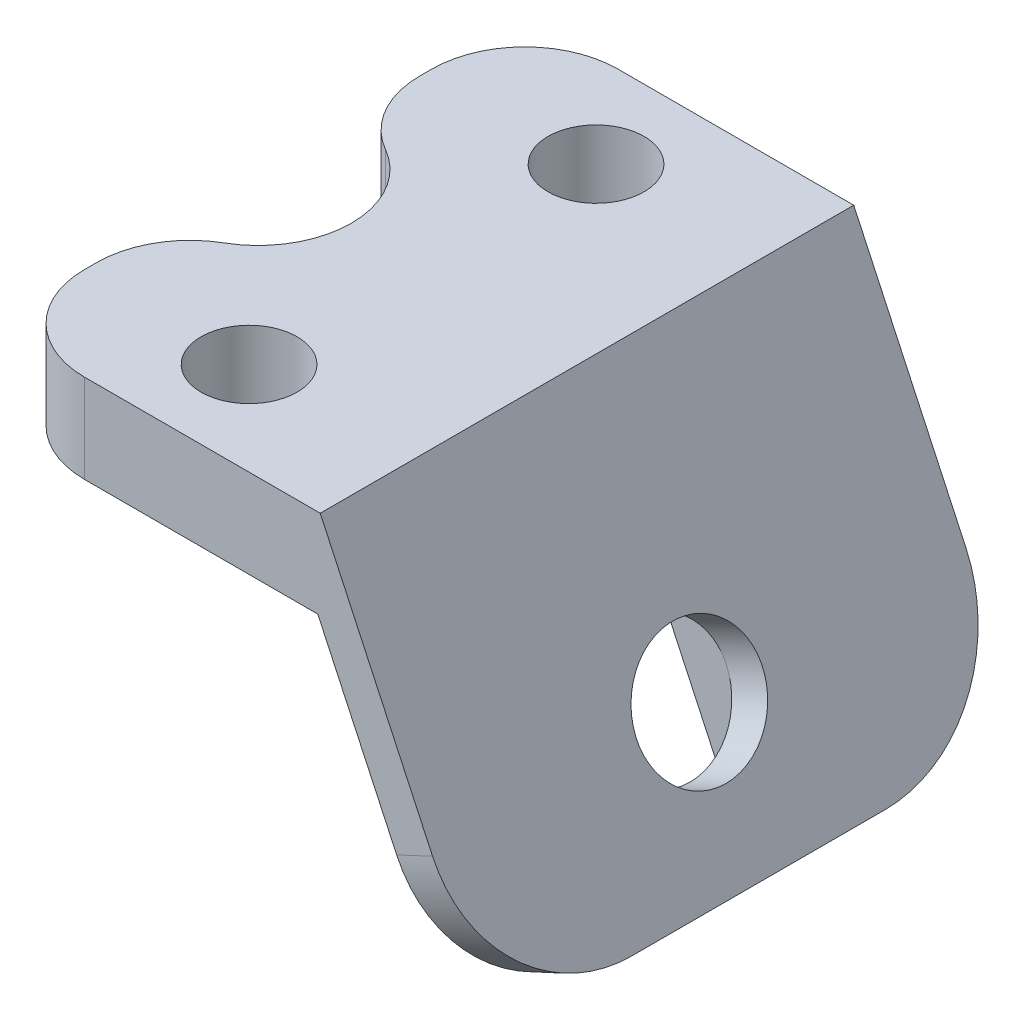
ISO-10303-21;
HEADER;
FILE_DESCRIPTION(('STEP AP214'),'2;1');
FILE_NAME('part.step','',(''),(''),'','','');
FILE_SCHEMA(('AUTOMOTIVE_DESIGN { 1 0 10303 214 1 1 1 1 }'));
ENDSEC;
DATA;
#1=APPLICATION_CONTEXT('core data for automotive mechanical design processes');
#2=APPLICATION_PROTOCOL_DEFINITION('international standard','automotive_design',2000,#1);
#3=PRODUCT_CONTEXT('',#1,'mechanical');
#4=PRODUCT('Part','Part','',(#3));
#5=PRODUCT_RELATED_PRODUCT_CATEGORY('part','',(#4));
#6=PRODUCT_DEFINITION_FORMATION('','',#4);
#7=PRODUCT_DEFINITION_CONTEXT('part definition',#1,'design');
#8=PRODUCT_DEFINITION('design','',#6,#7);
#9=PRODUCT_DEFINITION_SHAPE('','',#8);
#10=(LENGTH_UNIT() NAMED_UNIT(*) SI_UNIT(.MILLI.,.METRE.));
#11=(NAMED_UNIT(*) PLANE_ANGLE_UNIT() SI_UNIT($,.RADIAN.));
#12=(NAMED_UNIT(*) SI_UNIT($,.STERADIAN.) SOLID_ANGLE_UNIT());
#13=UNCERTAINTY_MEASURE_WITH_UNIT(LENGTH_MEASURE(1.E-05),#10,'distance_accuracy_value','');
#14=(GEOMETRIC_REPRESENTATION_CONTEXT(3) GLOBAL_UNCERTAINTY_ASSIGNED_CONTEXT((#13)) GLOBAL_UNIT_ASSIGNED_CONTEXT((#10,
#11,#12)) REPRESENTATION_CONTEXT('',''));
#15=CARTESIAN_POINT('',(0.,0.,0.));
#16=DIRECTION('',(0.,0.,1.));
#17=DIRECTION('',(1.,0.,0.));
#18=AXIS2_PLACEMENT_3D('',#15,#16,#17);
#19=CARTESIAN_POINT('',(0.,0.,29.0576));
#20=DIRECTION('',(1.,0.,0.));
#21=DIRECTION('',(0.,0.,-1.));
#22=AXIS2_PLACEMENT_3D('',#19,#20,#21);
#23=PLANE('',#22);
#24=DIRECTION('',(0.,0.,-1.));
#25=VECTOR('',#24,1.);
#26=CARTESIAN_POINT('',(0.,0.,29.0576));
#27=LINE('',#26,#25);
#28=CARTESIAN_POINT('',(0.,0.,5.7299818975501));
#29=VERTEX_POINT('',#28);
#30=CARTESIAN_POINT('',(0.,0.,5.08));
#31=VERTEX_POINT('',#30);
#32=EDGE_CURVE('E274',#29,#31,#27,.T.);
#33=ORIENTED_EDGE('',*,*,#32,.F.);
#34=DIRECTION('',(0.,1.,0.));
#35=VECTOR('',#34,1.);
#36=CARTESIAN_POINT('',(0.,0.,5.7299818975501));
#37=LINE('',#36,#35);
#38=CARTESIAN_POINT('',(0.,4.826,5.7299818975501));
#39=VERTEX_POINT('',#38);
#40=EDGE_CURVE('E11',#29,#39,#37,.T.);
#41=ORIENTED_EDGE('',*,*,#40,.T.);
#42=DIRECTION('',(0.,0.,-1.));
#43=VECTOR('',#42,1.);
#44=CARTESIAN_POINT('',(0.,4.826,29.0576));
#45=LINE('',#44,#43);
#46=CARTESIAN_POINT('',(0.,4.826,5.08));
#47=VERTEX_POINT('',#46);
#48=EDGE_CURVE('E286',#39,#47,#45,.T.);
#49=ORIENTED_EDGE('',*,*,#48,.T.);
#50=DIRECTION('',(0.,-1.,0.));
#51=VECTOR('',#50,1.);
#52=CARTESIAN_POINT('',(0.,0.,5.08));
#53=LINE('',#52,#51);
#54=EDGE_CURVE('E306',#47,#31,#53,.T.);
#55=ORIENTED_EDGE('',*,*,#54,.T.);
#56=EDGE_LOOP('',(#33,#41,#49,#55));
#57=FACE_BOUND('',#56,.T.);
#58=ADVANCED_FACE('F35',(#57),#23,.F.);
#59=CARTESIAN_POINT('',(25.2941526937496,-16.1141524535116,29.0576));
#60=DIRECTION('',(0.906307787036651,0.422618261740697,0.));
#61=DIRECTION('',(-0.422618261740697,0.906307787036651,0.));
#62=AXIS2_PLACEMENT_3D('',#59,#60,#61);
#63=PLANE('',#62);
#64=DIRECTION('',(0.422618261740697,-0.906307787036651,0.));
#65=VECTOR('',#64,1.);
#66=CARTESIAN_POINT('',(25.2941526937496,-16.1141524535116,0.));
#67=LINE('',#66,#65);
#68=CARTESIAN_POINT('',(17.78,0.,0.));
#69=VERTEX_POINT('',#68);
#70=CARTESIAN_POINT('',(22.0738015392855,-9.20808711629237,0.));
#71=VERTEX_POINT('',#70);
#72=EDGE_CURVE('E277',#69,#71,#67,.T.);
#73=ORIENTED_EDGE('',*,*,#72,.T.);
#74=CARTESIAN_POINT('',(22.0738015392855,-9.20808711629237,7.62));
#75=DIRECTION('',(0.906307787036651,0.422618261740697,0.));
#76=DIRECTION('',(-0.422618261740697,0.906307787036651,0.));
#77=AXIS2_PLACEMENT_3D('',#74,#75,#76);
#78=CIRCLE('',#77,7.62);
#79=CARTESIAN_POINT('',(25.2911277211085,-16.1076653787484,7.2898));
#80=VERTEX_POINT('',#79);
#81=EDGE_CURVE('E217',#71,#80,#78,.F.);
#82=ORIENTED_EDGE('',*,*,#81,.T.);
#83=DIRECTION('',(0.422618261740697,-0.906307787036651,0.));
#84=VECTOR('',#83,1.);
#85=CARTESIAN_POINT('',(18.8534503848214,-2.30202177907309,7.2898));
#86=LINE('',#85,#84);
#87=CARTESIAN_POINT('',(18.8534503848214,-2.30202177907309,7.2898));
#88=VERTEX_POINT('',#87);
#89=EDGE_CURVE('E194',#88,#80,#86,.T.);
#90=ORIENTED_EDGE('',*,*,#89,.F.);
#91=DIRECTION('',(0.,0.,1.));
#92=VECTOR('',#91,1.);
#93=CARTESIAN_POINT('',(18.8534503848214,-2.30202177907309,7.2898));
#94=LINE('',#93,#92);
#95=CARTESIAN_POINT('',(18.8534503848214,-2.30202177907309,11.0998));
#96=VERTEX_POINT('',#95);
#97=EDGE_CURVE('E205',#88,#96,#94,.T.);
#98=ORIENTED_EDGE('',*,*,#97,.T.);
#99=DIRECTION('',(0.422618261740697,-0.906307787036651,0.));
#100=VECTOR('',#99,1.);
#101=CARTESIAN_POINT('',(18.8534503848214,-2.30202177907309,11.0998));
#102=LINE('',#101,#100);
#103=CARTESIAN_POINT('',(22.0738015392855,-9.20808711629238,11.0998));
#104=VERTEX_POINT('',#103);
#105=EDGE_CURVE('E212',#96,#104,#102,.T.);
#106=ORIENTED_EDGE('',*,*,#105,.T.);
#107=CARTESIAN_POINT('',(22.0738015392855,-9.20808711629238,14.5288));
#108=DIRECTION('',(-0.906307787036651,-0.422618261740697,0.));
#109=DIRECTION('',(0.422618261740697,-0.906307787036651,0.));
#110=AXIS2_PLACEMENT_3D('',#107,#108,#109);
#111=CIRCLE('',#110,3.429);
#112=CARTESIAN_POINT('',(22.0738015392855,-9.20808711629238,17.9578));
#113=VERTEX_POINT('',#112);
#114=EDGE_CURVE('E259',#113,#104,#111,.T.);
#115=ORIENTED_EDGE('',*,*,#114,.F.);
#116=DIRECTION('',(0.422618261740697,-0.906307787036651,0.));
#117=VECTOR('',#116,1.);
#118=CARTESIAN_POINT('',(18.8534503848214,-2.30202177907309,17.9578));
#119=LINE('',#118,#117);
#120=CARTESIAN_POINT('',(18.8534503848214,-2.30202177907309,17.9578));
#121=VERTEX_POINT('',#120);
#122=EDGE_CURVE('E248',#121,#113,#119,.T.);
#123=ORIENTED_EDGE('',*,*,#122,.F.);
#124=DIRECTION('',(0.,0.,-1.));
#125=VECTOR('',#124,1.);
#126=CARTESIAN_POINT('',(18.8534503848214,-2.30202177907309,21.7678));
#127=LINE('',#126,#125);
#128=CARTESIAN_POINT('',(18.8534503848214,-2.30202177907309,21.7678));
#129=VERTEX_POINT('',#128);
#130=EDGE_CURVE('E211',#129,#121,#127,.T.);
#131=ORIENTED_EDGE('',*,*,#130,.F.);
#132=DIRECTION('',(0.422618261740697,-0.906307787036651,0.));
#133=VECTOR('',#132,1.);
#134=CARTESIAN_POINT('',(18.8534503848214,-2.30202177907309,21.7678));
#135=LINE('',#134,#133);
#136=CARTESIAN_POINT('',(25.2911277211085,-16.1076653787484,21.7678));
#137=VERTEX_POINT('',#136);
#138=EDGE_CURVE('E236',#129,#137,#135,.T.);
#139=ORIENTED_EDGE('',*,*,#138,.T.);
#140=CARTESIAN_POINT('',(22.0738015392855,-9.20808711629237,21.4376));
#141=DIRECTION('',(0.906307787036651,0.422618261740697,0.));
#142=DIRECTION('',(-0.422618261740697,0.906307787036651,0.));
#143=AXIS2_PLACEMENT_3D('',#140,#141,#142);
#144=CIRCLE('',#143,7.62);
#145=CARTESIAN_POINT('',(22.0738015392855,-9.20808711629237,29.0576));
#146=VERTEX_POINT('',#145);
#147=EDGE_CURVE('E334',#137,#146,#144,.F.);
#148=ORIENTED_EDGE('',*,*,#147,.T.);
#149=DIRECTION('',(0.422618261740697,-0.906307787036651,0.));
#150=VECTOR('',#149,1.);
#151=CARTESIAN_POINT('',(25.2941526937496,-16.1141524535116,29.0576));
#152=LINE('',#151,#150);
#153=CARTESIAN_POINT('',(17.78,0.,29.0576));
#154=VERTEX_POINT('',#153);
#155=EDGE_CURVE('E265',#154,#146,#152,.T.);
#156=ORIENTED_EDGE('',*,*,#155,.F.);
#157=DIRECTION('',(0.,0.,-1.));
#158=VECTOR('',#157,1.);
#159=CARTESIAN_POINT('',(17.78,0.,29.0576));
#160=LINE('',#159,#158);
#161=EDGE_CURVE('E299',#154,#69,#160,.T.);
#162=ORIENTED_EDGE('',*,*,#161,.T.);
#163=EDGE_LOOP('',(#73,#82,#90,#98,#106,#115,#123,#131,#139,#148,#156,#162));
#164=FACE_BOUND('',#163,.T.);
#165=ADVANCED_FACE('F215',(#164),#63,.F.);
#166=EDGE_CURVE('E258',#104,#113,#111,.T.);
#167=ORIENTED_EDGE('',*,*,#166,.F.);
#168=CARTESIAN_POINT('',(25.2941526937496,-16.1141524535117,11.0998));
#169=VERTEX_POINT('',#168);
#170=EDGE_CURVE('E218',#104,#169,#102,.T.);
#171=ORIENTED_EDGE('',*,*,#170,.T.);
#172=DIRECTION('',(0.,0.,-1.));
#173=VECTOR('',#172,1.);
#174=CARTESIAN_POINT('',(25.2941526937496,-16.1141524535116,29.0576));
#175=LINE('',#174,#173);
#176=CARTESIAN_POINT('',(25.2941526937496,-16.1141524535116,17.9578));
#177=VERTEX_POINT('',#176);
#178=EDGE_CURVE('E296',#177,#169,#175,.T.);
#179=ORIENTED_EDGE('',*,*,#178,.F.);
#180=EDGE_CURVE('E247',#113,#177,#119,.T.);
#181=ORIENTED_EDGE('',*,*,#180,.F.);
#182=EDGE_LOOP('',(#167,#171,#179,#181));
#183=FACE_BOUND('',#182,.T.);
#184=ADVANCED_FACE('F403',(#183),#63,.F.);
#185=CARTESIAN_POINT('',(17.78,0.,29.0576));
#186=DIRECTION('',(0.,1.,0.));
#187=DIRECTION('',(-1.,0.,0.));
#188=AXIS2_PLACEMENT_3D('',#185,#186,#187);
#189=PLANE('',#188);
#190=CARTESIAN_POINT('',(8.95589608439201,0.,5.08));
#191=DIRECTION('',(0.,1.,0.));
#192=DIRECTION('',(-1.,0.,0.));
#193=AXIS2_PLACEMENT_3D('',#190,#191,#192);
#194=CIRCLE('',#193,2.6162);
#195=CARTESIAN_POINT('',(6.33969608439201,0.,5.08));
#196=VERTEX_POINT('',#195);
#197=EDGE_CURVE('E202',#196,#196,#194,.T.);
#198=ORIENTED_EDGE('',*,*,#197,.T.);
#199=EDGE_LOOP('',(#198));
#200=FACE_BOUND('',#199,.T.);
#201=CARTESIAN_POINT('',(8.95589608439201,0.,23.9776));
#202=DIRECTION('',(0.,1.,0.));
#203=DIRECTION('',(-1.,0.,0.));
#204=AXIS2_PLACEMENT_3D('',#201,#202,#203);
#205=CIRCLE('',#204,2.6162);
#206=CARTESIAN_POINT('',(6.33969608439201,0.,23.9776));
#207=VERTEX_POINT('',#206);
#208=EDGE_CURVE('E388',#207,#207,#205,.T.);
#209=ORIENTED_EDGE('',*,*,#208,.T.);
#210=EDGE_LOOP('',(#209));
#211=FACE_BOUND('',#210,.T.);
#212=CARTESIAN_POINT('',(0.,0.,23.9776));
#213=VERTEX_POINT('',#212);
#214=CARTESIAN_POINT('',(0.,0.,23.3276181024499));
#215=VERTEX_POINT('',#214);
#216=EDGE_CURVE('E283',#213,#215,#27,.T.);
#217=ORIENTED_EDGE('',*,*,#216,.T.);
#218=CARTESIAN_POINT('',(5.08,0.,23.3276181024499));
#219=DIRECTION('',(0.,1.,0.));
#220=DIRECTION('',(-1.,0.,0.));
#221=AXIS2_PLACEMENT_3D('',#218,#219,#220);
#222=CIRCLE('',#221,5.08);
#223=CARTESIAN_POINT('',(2.54,0.,18.9282090512249));
#224=VERTEX_POINT('',#223);
#225=EDGE_CURVE('E353',#215,#224,#222,.F.);
#226=ORIENTED_EDGE('',*,*,#225,.T.);
#227=CARTESIAN_POINT('',(0.,0.,14.5288));
#228=DIRECTION('',(0.,1.,0.));
#229=DIRECTION('',(-1.,0.,0.));
#230=AXIS2_PLACEMENT_3D('',#227,#228,#229);
#231=CIRCLE('',#230,5.08);
#232=CARTESIAN_POINT('',(2.54,0.,10.1293909487751));
#233=VERTEX_POINT('',#232);
#234=EDGE_CURVE('E376',#224,#233,#231,.T.);
#235=ORIENTED_EDGE('',*,*,#234,.T.);
#236=CARTESIAN_POINT('',(5.08,0.,5.7299818975501));
#237=DIRECTION('',(0.,1.,0.));
#238=DIRECTION('',(-1.,0.,0.));
#239=AXIS2_PLACEMENT_3D('',#236,#237,#238);
#240=CIRCLE('',#239,5.08);
#241=EDGE_CURVE('E351',#233,#29,#240,.F.);
#242=ORIENTED_EDGE('',*,*,#241,.T.);
#243=ORIENTED_EDGE('',*,*,#32,.T.);
#244=CARTESIAN_POINT('',(5.08,0.,5.08));
#245=DIRECTION('',(0.,1.,0.));
#246=DIRECTION('',(-1.,0.,0.));
#247=AXIS2_PLACEMENT_3D('',#244,#245,#246);
#248=CIRCLE('',#247,5.08);
#249=CARTESIAN_POINT('',(5.08,0.,0.));
#250=VERTEX_POINT('',#249);
#251=EDGE_CURVE('E311',#31,#250,#248,.F.);
#252=ORIENTED_EDGE('',*,*,#251,.T.);
#253=DIRECTION('',(1.,0.,0.));
#254=VECTOR('',#253,1.);
#255=CARTESIAN_POINT('',(17.78,0.,0.));
#256=LINE('',#255,#254);
#257=EDGE_CURVE('E275',#250,#69,#256,.T.);
#258=ORIENTED_EDGE('',*,*,#257,.T.);
#259=ORIENTED_EDGE('',*,*,#161,.F.);
#260=DIRECTION('',(1.,0.,0.));
#261=VECTOR('',#260,1.);
#262=CARTESIAN_POINT('',(17.78,0.,29.0576));
#263=LINE('',#262,#261);
#264=CARTESIAN_POINT('',(5.08,0.,29.0576));
#265=VERTEX_POINT('',#264);
#266=EDGE_CURVE('E263',#265,#154,#263,.T.);
#267=ORIENTED_EDGE('',*,*,#266,.F.);
#268=CARTESIAN_POINT('',(5.08,0.,23.9776));
#269=DIRECTION('',(0.,1.,0.));
#270=DIRECTION('',(-1.,0.,0.));
#271=AXIS2_PLACEMENT_3D('',#268,#269,#270);
#272=CIRCLE('',#271,5.08);
#273=EDGE_CURVE('E309',#265,#213,#272,.F.);
#274=ORIENTED_EDGE('',*,*,#273,.T.);
#275=EDGE_LOOP('',(#217,#226,#235,#242,#243,#252,#258,#259,#267,#274));
#276=FACE_BOUND('',#275,.T.);
#277=ADVANCED_FACE('F375',(#200,#211,#276),#189,.F.);
#278=CARTESIAN_POINT('',(27.2508712059617,-15.2017196264135,29.0576));
#279=DIRECTION('',(-0.422618261740697,0.906307787036651,0.));
#280=DIRECTION('',(-0.906307787036651,-0.422618261740697,0.));
#281=AXIS2_PLACEMENT_3D('',#278,#279,#280);
#282=PLANE('',#281);
#283=DIRECTION('',(0.,0.,1.));
#284=VECTOR('',#283,1.);
#285=CARTESIAN_POINT('',(22.9921309146765,-17.187602838333,7.2898));
#286=LINE('',#285,#284);
#287=CARTESIAN_POINT('',(22.9921309146765,-17.187602838333,7.62));
#288=VERTEX_POINT('',#287);
#289=CARTESIAN_POINT('',(22.9921309146765,-17.187602838333,11.0998));
#290=VERTEX_POINT('',#289);
#291=EDGE_CURVE('E228',#288,#290,#286,.T.);
#292=ORIENTED_EDGE('',*,*,#291,.F.);
#293=DIRECTION('',(0.906307787036651,0.422618261740697,0.));
#294=VECTOR('',#293,1.);
#295=CARTESIAN_POINT('',(27.2508712059617,-15.2017196264135,7.62));
#296=LINE('',#295,#294);
#297=CARTESIAN_POINT('',(27.2508712059617,-15.2017196264135,7.62));
#298=VERTEX_POINT('',#297);
#299=EDGE_CURVE('E325',#288,#298,#296,.T.);
#300=ORIENTED_EDGE('',*,*,#299,.T.);
#301=DIRECTION('',(0.,0.,-1.));
#302=VECTOR('',#301,1.);
#303=CARTESIAN_POINT('',(27.2508712059617,-15.2017196264135,29.0576));
#304=LINE('',#303,#302);
#305=CARTESIAN_POINT('',(27.2508712059617,-15.2017196264135,21.4376));
#306=VERTEX_POINT('',#305);
#307=EDGE_CURVE('E293',#306,#298,#304,.T.);
#308=ORIENTED_EDGE('',*,*,#307,.F.);
#309=DIRECTION('',(0.906307787036651,0.422618261740697,0.));
#310=VECTOR('',#309,1.);
#311=CARTESIAN_POINT('',(27.2508712059617,-15.2017196264135,21.4376));
#312=LINE('',#311,#310);
#313=CARTESIAN_POINT('',(22.9921309146765,-17.187602838333,21.4376));
#314=VERTEX_POINT('',#313);
#315=EDGE_CURVE('E323',#306,#314,#312,.F.);
#316=ORIENTED_EDGE('',*,*,#315,.T.);
#317=DIRECTION('',(0.,0.,-1.));
#318=VECTOR('',#317,1.);
#319=CARTESIAN_POINT('',(22.9921309146765,-17.187602838333,21.7678));
#320=LINE('',#319,#318);
#321=CARTESIAN_POINT('',(22.9921309146765,-17.187602838333,17.9578));
#322=VERTEX_POINT('',#321);
#323=EDGE_CURVE('E239',#314,#322,#320,.T.);
#324=ORIENTED_EDGE('',*,*,#323,.T.);
#325=DIRECTION('',(0.906307787036651,0.422618261740697,0.));
#326=VECTOR('',#325,1.);
#327=CARTESIAN_POINT('',(22.9921309146765,-17.187602838333,17.9578));
#328=LINE('',#327,#326);
#329=EDGE_CURVE('E254',#322,#177,#328,.T.);
#330=ORIENTED_EDGE('',*,*,#329,.T.);
#331=ORIENTED_EDGE('',*,*,#178,.T.);
#332=DIRECTION('',(0.906307787036651,0.422618261740697,0.));
#333=VECTOR('',#332,1.);
#334=CARTESIAN_POINT('',(22.9921309146765,-17.187602838333,11.0998));
#335=LINE('',#334,#333);
#336=EDGE_CURVE('E201',#290,#169,#335,.T.);
#337=ORIENTED_EDGE('',*,*,#336,.F.);
#338=EDGE_LOOP('',(#292,#300,#308,#316,#324,#330,#331,#337));
#339=FACE_BOUND('',#338,.T.);
#340=ADVANCED_FACE('F405',(#339),#282,.F.);
#341=CARTESIAN_POINT('',(17.911792168784,4.826,29.0576));
#342=DIRECTION('',(-0.906307787036651,-0.422618261740697,0.));
#343=DIRECTION('',(0.422618261740697,-0.906307787036651,0.));
#344=AXIS2_PLACEMENT_3D('',#341,#342,#343);
#345=PLANE('',#344);
#346=CARTESIAN_POINT('',(24.0305200514976,-8.29565428919421,14.5288));
#347=DIRECTION('',(-0.906307787036651,-0.422618261740697,0.));
#348=DIRECTION('',(0.422618261740697,-0.906307787036651,0.));
#349=AXIS2_PLACEMENT_3D('',#346,#347,#348);
#350=CIRCLE('',#349,3.429);
#351=CARTESIAN_POINT('',(25.4796780710065,-11.4033836909429,14.5288));
#352=VERTEX_POINT('',#351);
#353=EDGE_CURVE('E262',#352,#352,#350,.T.);
#354=ORIENTED_EDGE('',*,*,#353,.T.);
#355=EDGE_LOOP('',(#354));
#356=FACE_BOUND('',#355,.T.);
#357=ORIENTED_EDGE('',*,*,#307,.T.);
#358=CARTESIAN_POINT('',(24.0305200514976,-8.2956542891942,7.62));
#359=DIRECTION('',(-0.906307787036651,-0.422618261740697,0.));
#360=DIRECTION('',(0.422618261740697,-0.906307787036651,0.));
#361=AXIS2_PLACEMENT_3D('',#358,#359,#360);
#362=CIRCLE('',#361,7.62);
#363=CARTESIAN_POINT('',(24.0305200514976,-8.2956542891942,0.));
#364=VERTEX_POINT('',#363);
#365=EDGE_CURVE('E330',#298,#364,#362,.F.);
#366=ORIENTED_EDGE('',*,*,#365,.T.);
#367=DIRECTION('',(-0.422618261740697,0.906307787036651,0.));
#368=VECTOR('',#367,1.);
#369=CARTESIAN_POINT('',(17.911792168784,4.826,0.));
#370=LINE('',#369,#368);
#371=CARTESIAN_POINT('',(17.911792168784,4.826,0.));
#372=VERTEX_POINT('',#371);
#373=EDGE_CURVE('E279',#364,#372,#370,.T.);
#374=ORIENTED_EDGE('',*,*,#373,.T.);
#375=DIRECTION('',(0.,0.,-1.));
#376=VECTOR('',#375,1.);
#377=CARTESIAN_POINT('',(17.911792168784,4.826,29.0576));
#378=LINE('',#377,#376);
#379=CARTESIAN_POINT('',(17.911792168784,4.826,29.0576));
#380=VERTEX_POINT('',#379);
#381=EDGE_CURVE('E290',#380,#372,#378,.T.);
#382=ORIENTED_EDGE('',*,*,#381,.F.);
#383=DIRECTION('',(-0.422618261740697,0.906307787036651,0.));
#384=VECTOR('',#383,1.);
#385=CARTESIAN_POINT('',(17.911792168784,4.826,29.0576));
#386=LINE('',#385,#384);
#387=CARTESIAN_POINT('',(24.0305200514976,-8.29565428919421,29.0576));
#388=VERTEX_POINT('',#387);
#389=EDGE_CURVE('E269',#388,#380,#386,.T.);
#390=ORIENTED_EDGE('',*,*,#389,.F.);
#391=CARTESIAN_POINT('',(24.0305200514976,-8.29565428919421,21.4376));
#392=DIRECTION('',(-0.906307787036651,-0.422618261740697,0.));
#393=DIRECTION('',(0.422618261740697,-0.906307787036651,0.));
#394=AXIS2_PLACEMENT_3D('',#391,#392,#393);
#395=CIRCLE('',#394,7.62);
#396=EDGE_CURVE('E328',#388,#306,#395,.F.);
#397=ORIENTED_EDGE('',*,*,#396,.T.);
#398=EDGE_LOOP('',(#357,#366,#374,#382,#390,#397));
#399=FACE_BOUND('',#398,.T.);
#400=ADVANCED_FACE('F423',(#356,#399),#345,.F.);
#401=CARTESIAN_POINT('',(0.,4.826,29.0576));
#402=DIRECTION('',(0.,-1.,0.));
#403=DIRECTION('',(1.,0.,0.));
#404=AXIS2_PLACEMENT_3D('',#401,#402,#403);
#405=PLANE('',#404);
#406=CARTESIAN_POINT('',(8.95589608439201,4.826,5.08));
#407=DIRECTION('',(0.,1.,0.));
#408=DIRECTION('',(0.,0.,1.));
#409=AXIS2_PLACEMENT_3D('',#406,#407,#408);
#410=CIRCLE('',#409,2.6162);
#411=CARTESIAN_POINT('',(8.95589608439201,4.826,7.69619999999999));
#412=VERTEX_POINT('',#411);
#413=EDGE_CURVE('E383',#412,#412,#410,.T.);
#414=ORIENTED_EDGE('',*,*,#413,.F.);
#415=EDGE_LOOP('',(#414));
#416=FACE_BOUND('',#415,.T.);
#417=CARTESIAN_POINT('',(8.95589608439201,4.826,23.9776));
#418=DIRECTION('',(0.,1.,0.));
#419=DIRECTION('',(0.,0.,1.));
#420=AXIS2_PLACEMENT_3D('',#417,#418,#419);
#421=CIRCLE('',#420,2.6162);
#422=CARTESIAN_POINT('',(8.95589608439201,4.826,26.5938));
#423=VERTEX_POINT('',#422);
#424=EDGE_CURVE('E380',#423,#423,#421,.T.);
#425=ORIENTED_EDGE('',*,*,#424,.F.);
#426=EDGE_LOOP('',(#425));
#427=FACE_BOUND('',#426,.T.);
#428=CARTESIAN_POINT('',(0.,4.826,14.5288));
#429=DIRECTION('',(0.,1.,0.));
#430=DIRECTION('',(0.,0.,1.));
#431=AXIS2_PLACEMENT_3D('',#428,#429,#430);
#432=CIRCLE('',#431,5.08);
#433=CARTESIAN_POINT('',(2.54,4.826,18.9282090512249));
#434=VERTEX_POINT('',#433);
#435=CARTESIAN_POINT('',(2.54,4.826,10.1293909487751));
#436=VERTEX_POINT('',#435);
#437=EDGE_CURVE('E363',#434,#436,#432,.T.);
#438=ORIENTED_EDGE('',*,*,#437,.F.);
#439=CARTESIAN_POINT('',(5.08,4.826,23.3276181024499));
#440=DIRECTION('',(0.,-1.,0.));
#441=DIRECTION('',(1.,0.,0.));
#442=AXIS2_PLACEMENT_3D('',#439,#440,#441);
#443=CIRCLE('',#442,5.08);
#444=CARTESIAN_POINT('',(0.,4.826,23.3276181024499));
#445=VERTEX_POINT('',#444);
#446=EDGE_CURVE('E43',#434,#445,#443,.F.);
#447=ORIENTED_EDGE('',*,*,#446,.T.);
#448=CARTESIAN_POINT('',(0.,4.826,23.9776));
#449=VERTEX_POINT('',#448);
#450=EDGE_CURVE('E287',#449,#445,#45,.T.);
#451=ORIENTED_EDGE('',*,*,#450,.F.);
#452=CARTESIAN_POINT('',(5.08,4.826,23.9776));
#453=DIRECTION('',(0.,-1.,0.));
#454=DIRECTION('',(1.,0.,0.));
#455=AXIS2_PLACEMENT_3D('',#452,#453,#454);
#456=CIRCLE('',#455,5.08);
#457=CARTESIAN_POINT('',(5.08,4.826,29.0576));
#458=VERTEX_POINT('',#457);
#459=EDGE_CURVE('E315',#449,#458,#456,.F.);
#460=ORIENTED_EDGE('',*,*,#459,.T.);
#461=DIRECTION('',(-1.,0.,0.));
#462=VECTOR('',#461,1.);
#463=CARTESIAN_POINT('',(0.,4.826,29.0576));
#464=LINE('',#463,#462);
#465=EDGE_CURVE('E271',#380,#458,#464,.T.);
#466=ORIENTED_EDGE('',*,*,#465,.F.);
#467=ORIENTED_EDGE('',*,*,#381,.T.);
#468=DIRECTION('',(-1.,0.,0.));
#469=VECTOR('',#468,1.);
#470=CARTESIAN_POINT('',(0.,4.826,0.));
#471=LINE('',#470,#469);
#472=CARTESIAN_POINT('',(5.08,4.826,0.));
#473=VERTEX_POINT('',#472);
#474=EDGE_CURVE('E266',#372,#473,#471,.T.);
#475=ORIENTED_EDGE('',*,*,#474,.T.);
#476=CARTESIAN_POINT('',(5.08,4.826,5.08));
#477=DIRECTION('',(0.,-1.,0.));
#478=DIRECTION('',(1.,0.,0.));
#479=AXIS2_PLACEMENT_3D('',#476,#477,#478);
#480=CIRCLE('',#479,5.08);
#481=EDGE_CURVE('E317',#473,#47,#480,.F.);
#482=ORIENTED_EDGE('',*,*,#481,.T.);
#483=ORIENTED_EDGE('',*,*,#48,.F.);
#484=CARTESIAN_POINT('',(5.08,4.826,5.7299818975501));
#485=DIRECTION('',(0.,-1.,0.));
#486=DIRECTION('',(1.,0.,0.));
#487=AXIS2_PLACEMENT_3D('',#484,#485,#486);
#488=CIRCLE('',#487,5.08);
#489=EDGE_CURVE('E50',#39,#436,#488,.F.);
#490=ORIENTED_EDGE('',*,*,#489,.T.);
#491=EDGE_LOOP('',(#438,#447,#451,#460,#466,#467,#475,#482,#483,#490));
#492=FACE_BOUND('',#491,.T.);
#493=ADVANCED_FACE('F361',(#416,#427,#492),#405,.F.);
#494=ORIENTED_EDGE('',*,*,#450,.T.);
#495=DIRECTION('',(0.,1.,0.));
#496=VECTOR('',#495,1.);
#497=CARTESIAN_POINT('',(0.,0.,23.3276181024499));
#498=LINE('',#497,#496);
#499=EDGE_CURVE('E348',#445,#215,#498,.F.);
#500=ORIENTED_EDGE('',*,*,#499,.T.);
#501=ORIENTED_EDGE('',*,*,#216,.F.);
#502=DIRECTION('',(0.,-1.,0.));
#503=VECTOR('',#502,1.);
#504=CARTESIAN_POINT('',(0.,0.,23.9776));
#505=LINE('',#504,#503);
#506=EDGE_CURVE('E302',#213,#449,#505,.F.);
#507=ORIENTED_EDGE('',*,*,#506,.T.);
#508=EDGE_LOOP('',(#494,#500,#501,#507));
#509=FACE_BOUND('',#508,.T.);
#510=ADVANCED_FACE('F368',(#509),#23,.F.);
#511=CARTESIAN_POINT('',(0.,0.,29.0576));
#512=DIRECTION('',(0.,0.,-1.));
#513=DIRECTION('',(-1.,0.,0.));
#514=AXIS2_PLACEMENT_3D('',#511,#512,#513);
#515=PLANE('',#514);
#516=ORIENTED_EDGE('',*,*,#155,.T.);
#517=DIRECTION('',(0.906307787036651,0.422618261740697,0.));
#518=VECTOR('',#517,1.);
#519=CARTESIAN_POINT('',(7.4694196891721,-16.0182222156201,29.0576));
#520=LINE('',#519,#518);
#521=EDGE_CURVE('E341',#146,#388,#520,.T.);
#522=ORIENTED_EDGE('',*,*,#521,.T.);
#523=ORIENTED_EDGE('',*,*,#389,.T.);
#524=ORIENTED_EDGE('',*,*,#465,.T.);
#525=DIRECTION('',(0.,-1.,0.));
#526=VECTOR('',#525,1.);
#527=CARTESIAN_POINT('',(5.08,0.,29.0576));
#528=LINE('',#527,#526);
#529=EDGE_CURVE('E320',#458,#265,#528,.T.);
#530=ORIENTED_EDGE('',*,*,#529,.T.);
#531=ORIENTED_EDGE('',*,*,#266,.T.);
#532=EDGE_LOOP('',(#516,#522,#523,#524,#530,#531));
#533=FACE_BOUND('',#532,.T.);
#534=ADVANCED_FACE('F449',(#533),#515,.F.);
#535=CARTESIAN_POINT('',(0.,0.,0.));
#536=DIRECTION('',(0.,0.,-1.));
#537=DIRECTION('',(-1.,0.,0.));
#538=AXIS2_PLACEMENT_3D('',#535,#536,#537);
#539=PLANE('',#538);
#540=ORIENTED_EDGE('',*,*,#373,.F.);
#541=DIRECTION('',(0.906307787036651,0.422618261740697,0.));
#542=VECTOR('',#541,1.);
#543=CARTESIAN_POINT('',(22.0738015392855,-9.20808711629236,0.));
#544=LINE('',#543,#542);
#545=EDGE_CURVE('E332',#364,#71,#544,.F.);
#546=ORIENTED_EDGE('',*,*,#545,.T.);
#547=ORIENTED_EDGE('',*,*,#72,.F.);
#548=ORIENTED_EDGE('',*,*,#257,.F.);
#549=DIRECTION('',(0.,-1.,0.));
#550=VECTOR('',#549,1.);
#551=CARTESIAN_POINT('',(5.08,4.826,0.));
#552=LINE('',#551,#550);
#553=EDGE_CURVE('E313',#250,#473,#552,.F.);
#554=ORIENTED_EDGE('',*,*,#553,.T.);
#555=ORIENTED_EDGE('',*,*,#474,.F.);
#556=EDGE_LOOP('',(#540,#546,#547,#548,#554,#555));
#557=FACE_BOUND('',#556,.T.);
#558=ADVANCED_FACE('F419',(#557),#539,.T.);
#559=CARTESIAN_POINT('',(31.7015817155771,-4.71857948905476,14.5288));
#560=DIRECTION('',(-0.906307787036651,-0.422618261740697,0.));
#561=DIRECTION('',(0.422618261740697,-0.906307787036651,0.));
#562=AXIS2_PLACEMENT_3D('',#559,#560,#561);
#563=CYLINDRICAL_SURFACE('',#562,3.429);
#564=ORIENTED_EDGE('',*,*,#114,.T.);
#565=ORIENTED_EDGE('',*,*,#166,.T.);
#566=EDGE_LOOP('',(#564,#565));
#567=FACE_BOUND('',#566,.T.);
#568=ORIENTED_EDGE('',*,*,#353,.F.);
#569=EDGE_LOOP('',(#568));
#570=FACE_BOUND('',#569,.T.);
#571=ADVANCED_FACE('F415',(#567,#570),#563,.F.);
#572=CARTESIAN_POINT('',(16.5514286057483,-3.37547216389446,21.7678));
#573=DIRECTION('',(0.422618261740697,-0.906307787036651,0.));
#574=DIRECTION('',(0.906307787036651,0.422618261740697,0.));
#575=AXIS2_PLACEMENT_3D('',#572,#573,#574);
#576=PLANE('',#575);
#577=ORIENTED_EDGE('',*,*,#130,.T.);
#578=DIRECTION('',(0.906307787036651,0.422618261740697,0.));
#579=VECTOR('',#578,1.);
#580=CARTESIAN_POINT('',(16.5514286057483,-3.37547216389446,17.9578));
#581=LINE('',#580,#579);
#582=CARTESIAN_POINT('',(16.5514286057483,-3.37547216389446,17.9578));
#583=VERTEX_POINT('',#582);
#584=EDGE_CURVE('E256',#583,#121,#581,.T.);
#585=ORIENTED_EDGE('',*,*,#584,.F.);
#586=DIRECTION('',(0.,0.,-1.));
#587=VECTOR('',#586,1.);
#588=CARTESIAN_POINT('',(16.5514286057483,-3.37547216389446,21.7678));
#589=LINE('',#588,#587);
#590=CARTESIAN_POINT('',(16.5514286057483,-3.37547216389446,21.7678));
#591=VERTEX_POINT('',#590);
#592=EDGE_CURVE('E232',#591,#583,#589,.T.);
#593=ORIENTED_EDGE('',*,*,#592,.F.);
#594=DIRECTION('',(0.906307787036651,0.422618261740697,0.));
#595=VECTOR('',#594,1.);
#596=CARTESIAN_POINT('',(16.5514286057483,-3.37547216389446,21.7678));
#597=LINE('',#596,#595);
#598=EDGE_CURVE('E244',#591,#129,#597,.T.);
#599=ORIENTED_EDGE('',*,*,#598,.T.);
#600=EDGE_LOOP('',(#577,#585,#593,#599));
#601=FACE_BOUND('',#600,.T.);
#602=ADVANCED_FACE('F418',(#601),#576,.F.);
#603=CARTESIAN_POINT('',(16.5514286057483,-3.37547216389446,17.9578));
#604=DIRECTION('',(0.,0.,1.));
#605=DIRECTION('',(1.,0.,0.));
#606=AXIS2_PLACEMENT_3D('',#603,#604,#605);
#607=PLANE('',#606);
#608=ORIENTED_EDGE('',*,*,#122,.T.);
#609=ORIENTED_EDGE('',*,*,#180,.T.);
#610=ORIENTED_EDGE('',*,*,#329,.F.);
#611=DIRECTION('',(0.422618261740697,-0.906307787036651,0.));
#612=VECTOR('',#611,1.);
#613=CARTESIAN_POINT('',(16.5514286057483,-3.37547216389446,17.9578));
#614=LINE('',#613,#612);
#615=EDGE_CURVE('E235',#583,#322,#614,.T.);
#616=ORIENTED_EDGE('',*,*,#615,.F.);
#617=ORIENTED_EDGE('',*,*,#584,.T.);
#618=EDGE_LOOP('',(#608,#609,#610,#616,#617));
#619=FACE_BOUND('',#618,.T.);
#620=ADVANCED_FACE('F410',(#619),#607,.F.);
#621=CARTESIAN_POINT('',(16.5514286057483,-3.37547216389446,21.7678));
#622=DIRECTION('',(0.,0.,1.));
#623=DIRECTION('',(1.,0.,0.));
#624=AXIS2_PLACEMENT_3D('',#621,#622,#623);
#625=PLANE('',#624);
#626=DIRECTION('',(0.422618261740697,-0.906307787036651,0.));
#627=VECTOR('',#626,1.);
#628=CARTESIAN_POINT('',(16.5514286057483,-3.37547216389446,21.7678));
#629=LINE('',#628,#627);
#630=CARTESIAN_POINT('',(22.9891059420354,-17.1811157635698,21.7678));
#631=VERTEX_POINT('',#630);
#632=EDGE_CURVE('E241',#591,#631,#629,.T.);
#633=ORIENTED_EDGE('',*,*,#632,.T.);
#634=DIRECTION('',(0.906307787036651,0.422618261740697,0.));
#635=VECTOR('',#634,1.);
#636=CARTESIAN_POINT('',(22.9891059420354,-17.1811157635698,21.7678));
#637=LINE('',#636,#635);
#638=EDGE_CURVE('E346',#631,#137,#637,.T.);
#639=ORIENTED_EDGE('',*,*,#638,.T.);
#640=ORIENTED_EDGE('',*,*,#138,.F.);
#641=ORIENTED_EDGE('',*,*,#598,.F.);
#642=EDGE_LOOP('',(#633,#639,#640,#641));
#643=FACE_BOUND('',#642,.T.);
#644=ADVANCED_FACE('F442',(#643),#625,.T.);
#645=CARTESIAN_POINT('',(12.3023600710403,5.73668471450632,0.));
#646=DIRECTION('',(-0.906307787036651,-0.422618261740697,0.));
#647=DIRECTION('',(0.422618261740697,-0.906307787036651,0.));
#648=AXIS2_PLACEMENT_3D('',#645,#646,#647);
#649=PLANE('',#648);
#650=ORIENTED_EDGE('',*,*,#323,.F.);
#651=CARTESIAN_POINT('',(19.7717797602124,-10.2815375011137,21.4376));
#652=DIRECTION('',(-0.906307787036651,-0.422618261740697,0.));
#653=DIRECTION('',(0.422618261740697,-0.906307787036651,0.));
#654=AXIS2_PLACEMENT_3D('',#651,#652,#653);
#655=CIRCLE('',#654,7.62);
#656=EDGE_CURVE('E344',#314,#631,#655,.T.);
#657=ORIENTED_EDGE('',*,*,#656,.T.);
#658=ORIENTED_EDGE('',*,*,#632,.F.);
#659=ORIENTED_EDGE('',*,*,#592,.T.);
#660=ORIENTED_EDGE('',*,*,#615,.T.);
#661=EDGE_LOOP('',(#650,#657,#658,#659,#660));
#662=FACE_BOUND('',#661,.T.);
#663=ADVANCED_FACE('F440',(#662),#649,.T.);
#664=CARTESIAN_POINT('',(16.5514286057483,-3.37547216389447,7.2898));
#665=DIRECTION('',(-0.422618261740697,0.906307787036651,0.));
#666=DIRECTION('',(-0.906307787036651,-0.422618261740697,0.));
#667=AXIS2_PLACEMENT_3D('',#664,#665,#666);
#668=PLANE('',#667);
#669=ORIENTED_EDGE('',*,*,#97,.F.);
#670=DIRECTION('',(0.906307787036651,0.422618261740697,0.));
#671=VECTOR('',#670,1.);
#672=CARTESIAN_POINT('',(16.5514286057483,-3.37547216389447,7.2898));
#673=LINE('',#672,#671);
#674=CARTESIAN_POINT('',(16.5514286057483,-3.37547216389447,7.2898));
#675=VERTEX_POINT('',#674);
#676=EDGE_CURVE('E190',#675,#88,#673,.T.);
#677=ORIENTED_EDGE('',*,*,#676,.F.);
#678=DIRECTION('',(0.,0.,1.));
#679=VECTOR('',#678,1.);
#680=CARTESIAN_POINT('',(16.5514286057483,-3.37547216389447,7.2898));
#681=LINE('',#680,#679);
#682=CARTESIAN_POINT('',(16.5514286057483,-3.37547216389447,11.0998));
#683=VERTEX_POINT('',#682);
#684=EDGE_CURVE('E219',#675,#683,#681,.T.);
#685=ORIENTED_EDGE('',*,*,#684,.T.);
#686=DIRECTION('',(0.906307787036651,0.422618261740697,0.));
#687=VECTOR('',#686,1.);
#688=CARTESIAN_POINT('',(16.5514286057483,-3.37547216389447,11.0998));
#689=LINE('',#688,#687);
#690=EDGE_CURVE('E207',#683,#96,#689,.T.);
#691=ORIENTED_EDGE('',*,*,#690,.T.);
#692=EDGE_LOOP('',(#669,#677,#685,#691));
#693=FACE_BOUND('',#692,.T.);
#694=ADVANCED_FACE('F206',(#693),#668,.T.);
#695=CARTESIAN_POINT('',(16.5514286057483,-3.37547216389447,7.2898));
#696=DIRECTION('',(0.,0.,1.));
#697=DIRECTION('',(1.,0.,0.));
#698=AXIS2_PLACEMENT_3D('',#695,#696,#697);
#699=PLANE('',#698);
#700=ORIENTED_EDGE('',*,*,#89,.T.);
#701=DIRECTION('',(-0.906307787036651,-0.422618261740697,0.));
#702=VECTOR('',#701,1.);
#703=CARTESIAN_POINT('',(25.2911277211085,-16.1076653787484,7.2898));
#704=LINE('',#703,#702);
#705=CARTESIAN_POINT('',(22.9891059420354,-17.1811157635698,7.2898));
#706=VERTEX_POINT('',#705);
#707=EDGE_CURVE('E337',#80,#706,#704,.T.);
#708=ORIENTED_EDGE('',*,*,#707,.T.);
#709=DIRECTION('',(0.422618261740697,-0.906307787036651,0.));
#710=VECTOR('',#709,1.);
#711=CARTESIAN_POINT('',(16.5514286057483,-3.37547216389447,7.2898));
#712=LINE('',#711,#710);
#713=EDGE_CURVE('E197',#675,#706,#712,.T.);
#714=ORIENTED_EDGE('',*,*,#713,.F.);
#715=ORIENTED_EDGE('',*,*,#676,.T.);
#716=EDGE_LOOP('',(#700,#708,#714,#715));
#717=FACE_BOUND('',#716,.T.);
#718=ADVANCED_FACE('F192',(#717),#699,.F.);
#719=CARTESIAN_POINT('',(16.5514286057483,-3.37547216389447,11.0998));
#720=DIRECTION('',(0.,0.,1.));
#721=DIRECTION('',(1.,0.,0.));
#722=AXIS2_PLACEMENT_3D('',#719,#720,#721);
#723=PLANE('',#722);
#724=ORIENTED_EDGE('',*,*,#105,.F.);
#725=ORIENTED_EDGE('',*,*,#690,.F.);
#726=DIRECTION('',(0.422618261740697,-0.906307787036651,0.));
#727=VECTOR('',#726,1.);
#728=CARTESIAN_POINT('',(16.5514286057483,-3.37547216389447,11.0998));
#729=LINE('',#728,#727);
#730=EDGE_CURVE('E223',#683,#290,#729,.T.);
#731=ORIENTED_EDGE('',*,*,#730,.T.);
#732=ORIENTED_EDGE('',*,*,#336,.T.);
#733=ORIENTED_EDGE('',*,*,#170,.F.);
#734=EDGE_LOOP('',(#724,#725,#731,#732,#733));
#735=FACE_BOUND('',#734,.T.);
#736=ADVANCED_FACE('F396',(#735),#723,.T.);
#737=CARTESIAN_POINT('',(12.3023600710403,5.73668471450632,0.));
#738=DIRECTION('',(0.906307787036651,0.422618261740697,0.));
#739=DIRECTION('',(-0.422618261740697,0.906307787036651,0.));
#740=AXIS2_PLACEMENT_3D('',#737,#738,#739);
#741=PLANE('',#740);
#742=ORIENTED_EDGE('',*,*,#713,.T.);
#743=CARTESIAN_POINT('',(19.7717797602124,-10.2815375011137,7.62));
#744=DIRECTION('',(0.906307787036651,0.422618261740697,0.));
#745=DIRECTION('',(-0.422618261740697,0.906307787036651,0.));
#746=AXIS2_PLACEMENT_3D('',#743,#744,#745);
#747=CIRCLE('',#746,7.62);
#748=EDGE_CURVE('E339',#706,#288,#747,.F.);
#749=ORIENTED_EDGE('',*,*,#748,.T.);
#750=ORIENTED_EDGE('',*,*,#291,.T.);
#751=ORIENTED_EDGE('',*,*,#730,.F.);
#752=ORIENTED_EDGE('',*,*,#684,.F.);
#753=EDGE_LOOP('',(#742,#749,#750,#751,#752));
#754=FACE_BOUND('',#753,.T.);
#755=ADVANCED_FACE('F466',(#754),#741,.F.);
#756=CARTESIAN_POINT('',(8.95589608439201,-17.187602838333,23.9776));
#757=DIRECTION('',(0.,1.,0.));
#758=DIRECTION('',(0.,0.,1.));
#759=AXIS2_PLACEMENT_3D('',#756,#757,#758);
#760=CYLINDRICAL_SURFACE('',#759,2.6162);
#761=ORIENTED_EDGE('',*,*,#424,.T.);
#762=EDGE_LOOP('',(#761));
#763=FACE_BOUND('',#762,.T.);
#764=ORIENTED_EDGE('',*,*,#208,.F.);
#765=EDGE_LOOP('',(#764));
#766=FACE_BOUND('',#765,.T.);
#767=ADVANCED_FACE('F468',(#763,#766),#760,.F.);
#768=CARTESIAN_POINT('',(8.95589608439201,-17.187602838333,5.08));
#769=DIRECTION('',(0.,1.,0.));
#770=DIRECTION('',(0.,0.,1.));
#771=AXIS2_PLACEMENT_3D('',#768,#769,#770);
#772=CYLINDRICAL_SURFACE('',#771,2.6162);
#773=ORIENTED_EDGE('',*,*,#413,.T.);
#774=EDGE_LOOP('',(#773));
#775=FACE_BOUND('',#774,.T.);
#776=ORIENTED_EDGE('',*,*,#197,.F.);
#777=EDGE_LOOP('',(#776));
#778=FACE_BOUND('',#777,.T.);
#779=ADVANCED_FACE('F474',(#775,#778),#772,.F.);
#780=CARTESIAN_POINT('',(5.08,0.,5.08));
#781=DIRECTION('',(0.,1.,0.));
#782=DIRECTION('',(0.,0.,1.));
#783=AXIS2_PLACEMENT_3D('',#780,#781,#782);
#784=CYLINDRICAL_SURFACE('',#783,5.08);
#785=ORIENTED_EDGE('',*,*,#481,.F.);
#786=ORIENTED_EDGE('',*,*,#553,.F.);
#787=ORIENTED_EDGE('',*,*,#251,.F.);
#788=ORIENTED_EDGE('',*,*,#54,.F.);
#789=EDGE_LOOP('',(#785,#786,#787,#788));
#790=FACE_BOUND('',#789,.T.);
#791=ADVANCED_FACE('F508',(#790),#784,.T.);
#792=CARTESIAN_POINT('',(5.08,0.,23.9776));
#793=DIRECTION('',(0.,-1.,0.));
#794=DIRECTION('',(0.,0.,-1.));
#795=AXIS2_PLACEMENT_3D('',#792,#793,#794);
#796=CYLINDRICAL_SURFACE('',#795,5.08);
#797=ORIENTED_EDGE('',*,*,#459,.F.);
#798=ORIENTED_EDGE('',*,*,#506,.F.);
#799=ORIENTED_EDGE('',*,*,#273,.F.);
#800=ORIENTED_EDGE('',*,*,#529,.F.);
#801=EDGE_LOOP('',(#797,#798,#799,#800));
#802=FACE_BOUND('',#801,.T.);
#803=ADVANCED_FACE('F456',(#802),#796,.T.);
#804=CARTESIAN_POINT('',(24.0305200514976,-8.2956542891942,7.62));
#805=DIRECTION('',(-0.906307787036651,-0.422618261740697,0.));
#806=DIRECTION('',(0.422618261740697,-0.906307787036651,0.));
#807=AXIS2_PLACEMENT_3D('',#804,#805,#806);
#808=CYLINDRICAL_SURFACE('',#807,7.62);
#809=ORIENTED_EDGE('',*,*,#81,.F.);
#810=ORIENTED_EDGE('',*,*,#545,.F.);
#811=ORIENTED_EDGE('',*,*,#365,.F.);
#812=ORIENTED_EDGE('',*,*,#299,.F.);
#813=ORIENTED_EDGE('',*,*,#748,.F.);
#814=ORIENTED_EDGE('',*,*,#707,.F.);
#815=EDGE_LOOP('',(#809,#810,#811,#812,#813,#814));
#816=FACE_BOUND('',#815,.T.);
#817=ADVANCED_FACE('F463',(#816),#808,.T.);
#818=CARTESIAN_POINT('',(7.4694196891721,-16.0182222156201,21.4376));
#819=DIRECTION('',(0.906307787036651,0.422618261740697,0.));
#820=DIRECTION('',(-0.422618261740697,0.906307787036651,0.));
#821=AXIS2_PLACEMENT_3D('',#818,#819,#820);
#822=CYLINDRICAL_SURFACE('',#821,7.62);
#823=ORIENTED_EDGE('',*,*,#656,.F.);
#824=ORIENTED_EDGE('',*,*,#315,.F.);
#825=ORIENTED_EDGE('',*,*,#396,.F.);
#826=ORIENTED_EDGE('',*,*,#521,.F.);
#827=ORIENTED_EDGE('',*,*,#147,.F.);
#828=ORIENTED_EDGE('',*,*,#638,.F.);
#829=EDGE_LOOP('',(#823,#824,#825,#826,#827,#828));
#830=FACE_BOUND('',#829,.T.);
#831=ADVANCED_FACE('F434',(#830),#822,.T.);
#832=CARTESIAN_POINT('',(0.,-5.334,14.5288));
#833=DIRECTION('',(0.,1.,0.));
#834=DIRECTION('',(0.,0.,1.));
#835=AXIS2_PLACEMENT_3D('',#832,#833,#834);
#836=CYLINDRICAL_SURFACE('',#835,5.08);
#837=ORIENTED_EDGE('',*,*,#234,.F.);
#838=DIRECTION('',(0.,1.,0.));
#839=VECTOR('',#838,1.);
#840=CARTESIAN_POINT('',(2.54,-5.334,18.9282090512249));
#841=LINE('',#840,#839);
#842=EDGE_CURVE('E357',#224,#434,#841,.T.);
#843=ORIENTED_EDGE('',*,*,#842,.T.);
#844=ORIENTED_EDGE('',*,*,#437,.T.);
#845=DIRECTION('',(0.,1.,0.));
#846=VECTOR('',#845,1.);
#847=CARTESIAN_POINT('',(2.54,-5.334,10.1293909487751));
#848=LINE('',#847,#846);
#849=EDGE_CURVE('E355',#436,#233,#848,.F.);
#850=ORIENTED_EDGE('',*,*,#849,.T.);
#851=EDGE_LOOP('',(#837,#843,#844,#850));
#852=FACE_BOUND('',#851,.T.);
#853=ADVANCED_FACE('F379',(#852),#836,.F.);
#854=CARTESIAN_POINT('',(5.08,-5.334,23.3276181024499));
#855=DIRECTION('',(0.,1.,0.));
#856=DIRECTION('',(0.,0.,1.));
#857=AXIS2_PLACEMENT_3D('',#854,#855,#856);
#858=CYLINDRICAL_SURFACE('',#857,5.08);
#859=ORIENTED_EDGE('',*,*,#446,.F.);
#860=ORIENTED_EDGE('',*,*,#842,.F.);
#861=ORIENTED_EDGE('',*,*,#225,.F.);
#862=ORIENTED_EDGE('',*,*,#499,.F.);
#863=EDGE_LOOP('',(#859,#860,#861,#862));
#864=FACE_BOUND('',#863,.T.);
#865=ADVANCED_FACE('F371',(#864),#858,.T.);
#866=CARTESIAN_POINT('',(5.08,-5.334,5.7299818975501));
#867=DIRECTION('',(0.,1.,0.));
#868=DIRECTION('',(0.,0.,1.));
#869=AXIS2_PLACEMENT_3D('',#866,#867,#868);
#870=CYLINDRICAL_SURFACE('',#869,5.08);
#871=ORIENTED_EDGE('',*,*,#241,.F.);
#872=ORIENTED_EDGE('',*,*,#849,.F.);
#873=ORIENTED_EDGE('',*,*,#489,.F.);
#874=ORIENTED_EDGE('',*,*,#40,.F.);
#875=EDGE_LOOP('',(#871,#872,#873,#874));
#876=FACE_BOUND('',#875,.T.);
#877=ADVANCED_FACE('F37',(#876),#870,.T.);
#878=CLOSED_SHELL('',(#58,#165,#184,#277,#340,#400,#493,#510,#534,#558,#571,#602,#620,#644,#663,
#694,#718,#736,#755,#767,#779,#791,#803,#817,#831,#853,#865,#877));
#879=MANIFOLD_SOLID_BREP('B2',#878);
#880=ADVANCED_BREP_SHAPE_REPRESENTATION('',(#18,#879),#14);
#881=SHAPE_DEFINITION_REPRESENTATION(#9,#880);
ENDSEC;
END-ISO-10303-21;
